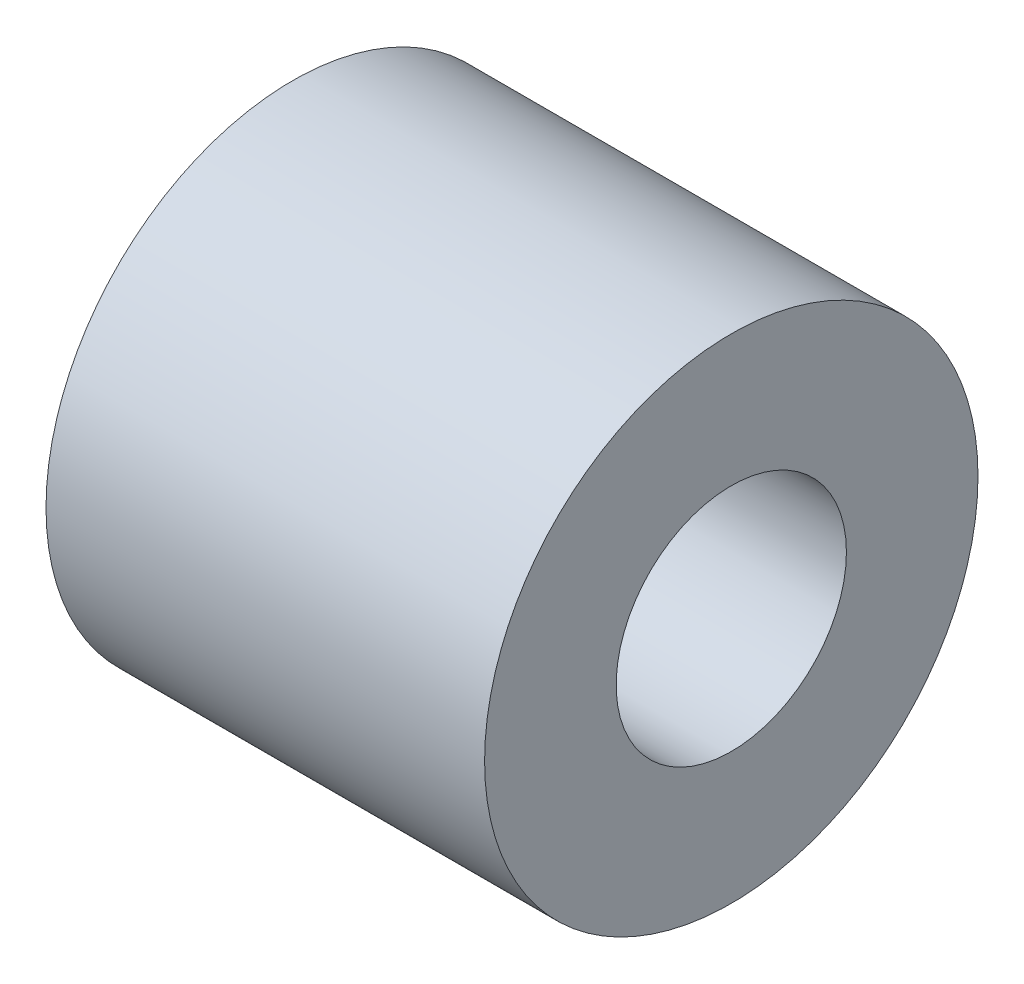
ISO-10303-21;
HEADER;
FILE_DESCRIPTION(('STEP AP214'),'2;1');
FILE_NAME('part.step','',(''),(''),'','','');
FILE_SCHEMA(('AUTOMOTIVE_DESIGN { 1 0 10303 214 1 1 1 1 }'));
ENDSEC;
DATA;
#1=APPLICATION_CONTEXT('core data for automotive mechanical design processes');
#2=APPLICATION_PROTOCOL_DEFINITION('international standard','automotive_design',2000,#1);
#3=PRODUCT_CONTEXT('',#1,'mechanical');
#4=PRODUCT('Part','Part','',(#3));
#5=PRODUCT_RELATED_PRODUCT_CATEGORY('part','',(#4));
#6=PRODUCT_DEFINITION_FORMATION('','',#4);
#7=PRODUCT_DEFINITION_CONTEXT('part definition',#1,'design');
#8=PRODUCT_DEFINITION('design','',#6,#7);
#9=PRODUCT_DEFINITION_SHAPE('','',#8);
#10=(LENGTH_UNIT() NAMED_UNIT(*) SI_UNIT(.MILLI.,.METRE.));
#11=(NAMED_UNIT(*) PLANE_ANGLE_UNIT() SI_UNIT($,.RADIAN.));
#12=(NAMED_UNIT(*) SI_UNIT($,.STERADIAN.) SOLID_ANGLE_UNIT());
#13=UNCERTAINTY_MEASURE_WITH_UNIT(LENGTH_MEASURE(1.E-05),#10,'distance_accuracy_value','');
#14=(GEOMETRIC_REPRESENTATION_CONTEXT(3) GLOBAL_UNCERTAINTY_ASSIGNED_CONTEXT((#13)) GLOBAL_UNIT_ASSIGNED_CONTEXT((#10,
#11,#12)) REPRESENTATION_CONTEXT('',''));
#15=CARTESIAN_POINT('',(0.,0.,0.));
#16=DIRECTION('',(0.,0.,1.));
#17=DIRECTION('',(1.,0.,0.));
#18=AXIS2_PLACEMENT_3D('',#15,#16,#17);
#19=CARTESIAN_POINT('',(0.,0.,0.));
#20=DIRECTION('',(1.,0.,0.));
#21=DIRECTION('',(0.,0.,-1.));
#22=AXIS2_PLACEMENT_3D('',#19,#20,#21);
#23=CYLINDRICAL_SURFACE('',#22,22.5);
#24=CARTESIAN_POINT('',(-40.,0.,0.));
#25=DIRECTION('',(1.,0.,0.));
#26=DIRECTION('',(0.,0.,-1.));
#27=AXIS2_PLACEMENT_3D('',#24,#25,#26);
#28=CIRCLE('',#27,22.5);
#29=CARTESIAN_POINT('',(-40.,0.,-22.5));
#30=VERTEX_POINT('',#29);
#31=EDGE_CURVE('E56',#30,#30,#28,.T.);
#32=ORIENTED_EDGE('',*,*,#31,.T.);
#33=EDGE_LOOP('',(#32));
#34=FACE_BOUND('',#33,.T.);
#35=CARTESIAN_POINT('',(0.,0.,0.));
#36=DIRECTION('',(1.,0.,0.));
#37=DIRECTION('',(0.,0.,-1.));
#38=AXIS2_PLACEMENT_3D('',#35,#36,#37);
#39=CIRCLE('',#38,22.5);
#40=CARTESIAN_POINT('',(0.,0.,-22.5));
#41=VERTEX_POINT('',#40);
#42=EDGE_CURVE('E10',#41,#41,#39,.T.);
#43=ORIENTED_EDGE('',*,*,#42,.F.);
#44=EDGE_LOOP('',(#43));
#45=FACE_BOUND('',#44,.T.);
#46=ADVANCED_FACE('F39',(#34,#45),#23,.T.);
#47=CARTESIAN_POINT('',(0.,22.5,0.));
#48=DIRECTION('',(1.,0.,0.));
#49=DIRECTION('',(0.,0.,-1.));
#50=AXIS2_PLACEMENT_3D('',#47,#48,#49);
#51=PLANE('',#50);
#52=ORIENTED_EDGE('',*,*,#42,.T.);
#53=EDGE_LOOP('',(#52));
#54=FACE_BOUND('',#53,.T.);
#55=CARTESIAN_POINT('',(0.,0.,0.));
#56=DIRECTION('',(1.,0.,0.));
#57=DIRECTION('',(0.,0.,-1.));
#58=AXIS2_PLACEMENT_3D('',#55,#56,#57);
#59=CIRCLE('',#58,10.5);
#60=CARTESIAN_POINT('',(0.,0.,-10.5));
#61=VERTEX_POINT('',#60);
#62=EDGE_CURVE('E46',#61,#61,#59,.T.);
#63=ORIENTED_EDGE('',*,*,#62,.F.);
#64=EDGE_LOOP('',(#63));
#65=FACE_BOUND('',#64,.T.);
#66=ADVANCED_FACE('F73',(#54,#65),#51,.T.);
#67=CARTESIAN_POINT('',(0.,0.,0.));
#68=DIRECTION('',(1.,0.,0.));
#69=DIRECTION('',(0.,0.,-1.));
#70=AXIS2_PLACEMENT_3D('',#67,#68,#69);
#71=CYLINDRICAL_SURFACE('',#70,10.5);
#72=ORIENTED_EDGE('',*,*,#62,.T.);
#73=EDGE_LOOP('',(#72));
#74=FACE_BOUND('',#73,.T.);
#75=CARTESIAN_POINT('',(-40.,0.,0.));
#76=DIRECTION('',(1.,0.,0.));
#77=DIRECTION('',(0.,0.,-1.));
#78=AXIS2_PLACEMENT_3D('',#75,#76,#77);
#79=CIRCLE('',#78,10.5);
#80=CARTESIAN_POINT('',(-40.,0.,-10.5));
#81=VERTEX_POINT('',#80);
#82=EDGE_CURVE('E51',#81,#81,#79,.T.);
#83=ORIENTED_EDGE('',*,*,#82,.F.);
#84=EDGE_LOOP('',(#83));
#85=FACE_BOUND('',#84,.T.);
#86=ADVANCED_FACE('F67',(#74,#85),#71,.F.);
#87=CARTESIAN_POINT('',(-40.,10.5,0.));
#88=DIRECTION('',(-1.,0.,0.));
#89=DIRECTION('',(0.,0.,1.));
#90=AXIS2_PLACEMENT_3D('',#87,#88,#89);
#91=PLANE('',#90);
#92=ORIENTED_EDGE('',*,*,#82,.T.);
#93=EDGE_LOOP('',(#92));
#94=FACE_BOUND('',#93,.T.);
#95=ORIENTED_EDGE('',*,*,#31,.F.);
#96=EDGE_LOOP('',(#95));
#97=FACE_BOUND('',#96,.T.);
#98=ADVANCED_FACE('F65',(#94,#97),#91,.T.);
#99=CLOSED_SHELL('',(#46,#66,#86,#98));
#100=MANIFOLD_SOLID_BREP('B2',#99);
#101=ADVANCED_BREP_SHAPE_REPRESENTATION('',(#18,#100),#14);
#102=SHAPE_DEFINITION_REPRESENTATION(#9,#101);
ENDSEC;
END-ISO-10303-21;
